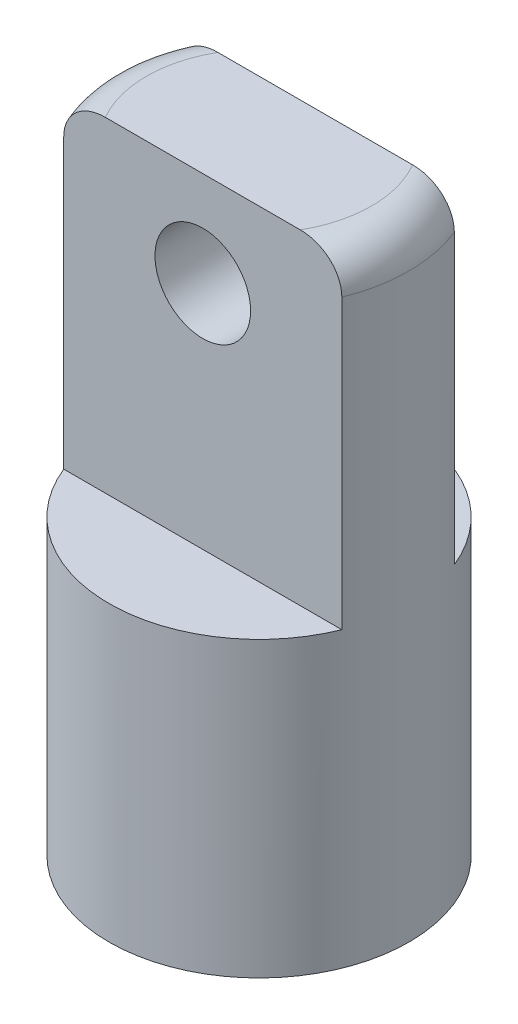
ISO-10303-21;
HEADER;
FILE_DESCRIPTION(('STEP AP214'),'2;1');
FILE_NAME('part.step','',(''),(''),'','','');
FILE_SCHEMA(('AUTOMOTIVE_DESIGN { 1 0 10303 214 1 1 1 1 }'));
ENDSEC;
DATA;
#1=APPLICATION_CONTEXT('core data for automotive mechanical design processes');
#2=APPLICATION_PROTOCOL_DEFINITION('international standard','automotive_design',2000,#1);
#3=PRODUCT_CONTEXT('',#1,'mechanical');
#4=PRODUCT('Part','Part','',(#3));
#5=PRODUCT_RELATED_PRODUCT_CATEGORY('part','',(#4));
#6=PRODUCT_DEFINITION_FORMATION('','',#4);
#7=PRODUCT_DEFINITION_CONTEXT('part definition',#1,'design');
#8=PRODUCT_DEFINITION('design','',#6,#7);
#9=PRODUCT_DEFINITION_SHAPE('','',#8);
#10=(LENGTH_UNIT() NAMED_UNIT(*) SI_UNIT(.MILLI.,.METRE.));
#11=(NAMED_UNIT(*) PLANE_ANGLE_UNIT() SI_UNIT($,.RADIAN.));
#12=(NAMED_UNIT(*) SI_UNIT($,.STERADIAN.) SOLID_ANGLE_UNIT());
#13=UNCERTAINTY_MEASURE_WITH_UNIT(LENGTH_MEASURE(1.E-05),#10,'distance_accuracy_value','');
#14=(GEOMETRIC_REPRESENTATION_CONTEXT(3) GLOBAL_UNCERTAINTY_ASSIGNED_CONTEXT((#13)) GLOBAL_UNIT_ASSIGNED_CONTEXT((#10,
#11,#12)) REPRESENTATION_CONTEXT('',''));
#15=CARTESIAN_POINT('',(0.,0.,0.));
#16=DIRECTION('',(0.,0.,1.));
#17=DIRECTION('',(1.,0.,0.));
#18=AXIS2_PLACEMENT_3D('',#15,#16,#17);
#19=CARTESIAN_POINT('',(0.,16.5,0.));
#20=DIRECTION('',(0.,-1.,0.));
#21=DIRECTION('',(0.,0.,-1.));
#22=AXIS2_PLACEMENT_3D('',#19,#20,#21);
#23=CYLINDRICAL_SURFACE('',#22,4.);
#24=CARTESIAN_POINT('',(0.,5.99,-4.));
#25=CARTESIAN_POINT('',(-0.0694781275048535,5.9899997175562,-3.99999976870814));
#26=CARTESIAN_POINT('',(-0.138959448119634,5.98427983607162,-3.99817280072155));
#27=CARTESIAN_POINT('',(-0.275886697916306,5.96161375224078,-3.99106387603711));
#28=CARTESIAN_POINT('',(-0.343332222967742,5.94466533601831,-3.98578123800401));
#29=CARTESIAN_POINT('',(-0.474193715803413,5.90017381597049,-3.97233734224439));
#30=CARTESIAN_POINT('',(-0.537615856290475,5.87264742256976,-3.9641806264856));
#31=CARTESIAN_POINT('',(-0.658944121988134,5.80785346321896,-3.94582848984878));
#32=CARTESIAN_POINT('',(-0.71684932235342,5.77058426791792,-3.93563272803513));
#33=CARTESIAN_POINT('',(-0.827339957593791,5.68611682974675,-3.91392026388596));
#34=CARTESIAN_POINT('',(-0.879725595012806,5.63866484075298,-3.90237409777714));
#35=CARTESIAN_POINT('',(-0.975944929578622,5.53571888399772,-3.87943076396434));
#36=CARTESIAN_POINT('',(-1.01977696894614,5.48022336093775,-3.86803362554208));
#37=CARTESIAN_POINT('',(-1.09874153414216,5.36101984643483,-3.846360756299));
#38=CARTESIAN_POINT('',(-1.13362209741506,5.29713772577821,-3.83612128520392));
#39=CARTESIAN_POINT('',(-1.19206127035785,5.16403653695254,-3.81836738990007));
#40=CARTESIAN_POINT('',(-1.2156229721165,5.09481893233485,-3.81085222160356));
#41=CARTESIAN_POINT('',(-1.25002016554083,4.9552704525187,-3.79970649861637));
#42=CARTESIAN_POINT('',(-1.2612271872395,4.88504044393,-3.79596284606404));
#43=CARTESIAN_POINT('',(-1.27175780060462,4.74360486605652,-3.792448519286));
#44=CARTESIAN_POINT('',(-1.27108466910094,4.67239957119332,-3.79267674951997));
#45=CARTESIAN_POINT('',(-1.2581641699041,4.53412989157325,-3.7969807386488));
#46=CARTESIAN_POINT('',(-1.24639198042002,4.46701535316813,-3.80089853044576));
#47=CARTESIAN_POINT('',(-1.21237908082845,4.33576814619416,-3.81188314768159));
#48=CARTESIAN_POINT('',(-1.19013722536956,4.27163580471274,-3.81895031764889));
#49=CARTESIAN_POINT('',(-1.13548661443087,4.14705385287107,-3.83555644620986));
#50=CARTESIAN_POINT('',(-1.10293064255435,4.08667374648119,-3.84513082427279));
#51=CARTESIAN_POINT('',(-1.02867816571385,3.97207903093476,-3.86565667683642));
#52=CARTESIAN_POINT('',(-0.98697922249008,3.91786607231005,-3.87660851834808));
#53=CARTESIAN_POINT('',(-0.893304383982998,3.81446190489048,-3.89928615777714));
#54=CARTESIAN_POINT('',(-0.840937086029641,3.76562726950401,-3.91102411889805));
#55=CARTESIAN_POINT('',(-0.728610503858204,3.67734484809147,-3.93349755948319));
#56=CARTESIAN_POINT('',(-0.668650620914784,3.63789780304586,-3.94423295977278));
#57=CARTESIAN_POINT('',(-0.542137579133865,3.56925821441149,-3.96361074874143));
#58=CARTESIAN_POINT('',(-0.475533996002266,3.54015317098005,-3.972235094503));
#59=CARTESIAN_POINT('',(-0.338038188376032,3.49366722157475,-3.98628865725283));
#60=CARTESIAN_POINT('',(-0.267147317502995,3.47628263595236,-3.99171887697157));
#61=CARTESIAN_POINT('',(-0.12611406157382,3.45434417821691,-3.99860987572172));
#62=CARTESIAN_POINT('',(-0.0560539133869254,3.44930780744824,-4.00021984340975));
#63=CARTESIAN_POINT('',(0.0839193333622004,3.45084504777036,-3.99973162638443));
#64=CARTESIAN_POINT('',(0.153832452574231,3.45741690192619,-3.99763400282459));
#65=CARTESIAN_POINT('',(0.289649571216873,3.4815979281653,-3.99006444968686));
#66=CARTESIAN_POINT('',(0.355610472033454,3.49891787603743,-3.98468100007415));
#67=CARTESIAN_POINT('',(0.483669854221075,3.54374849378021,-3.97117272755714));
#68=CARTESIAN_POINT('',(0.545767853062375,3.5712604337978,-3.96304756298597));
#69=CARTESIAN_POINT('',(0.666056605274354,3.63645725065976,-3.94463755171274));
#70=CARTESIAN_POINT('',(0.724111846583209,3.67437802399565,-3.93430403678396));
#71=CARTESIAN_POINT('',(0.833195647610185,3.75903448227932,-3.91265673613529));
#72=CARTESIAN_POINT('',(0.884222236774226,3.80577263060028,-3.90134267695242));
#73=CARTESIAN_POINT('',(0.979972556103621,3.90900690278926,-3.87842479752882));
#74=CARTESIAN_POINT('',(1.02435223440474,3.96582445711621,-3.86682810743868));
#75=CARTESIAN_POINT('',(1.10298077839377,4.08635197604293,-3.84514014023485));
#76=CARTESIAN_POINT('',(1.13722975464655,4.15006186541049,-3.8350488466921));
#77=CARTESIAN_POINT('',(1.1944226299821,4.28246742208174,-3.81762370141084));
#78=CARTESIAN_POINT('',(1.21740601455216,4.35114469308412,-3.8102802403533));
#79=CARTESIAN_POINT('',(1.25139491731108,4.49167697310513,-3.799254696408));
#80=CARTESIAN_POINT('',(1.26240518484185,4.56353071034535,-3.79557116179783));
#81=CARTESIAN_POINT('',(1.27178712505359,4.70477013780484,-3.79243711089675));
#82=CARTESIAN_POINT('',(1.27072472730476,4.77411448323694,-3.7927970400332));
#83=CARTESIAN_POINT('',(1.25736392956772,4.91158399673968,-3.79724695012912));
#84=CARTESIAN_POINT('',(1.24506608589155,4.97970922500342,-3.80133674640788));
#85=CARTESIAN_POINT('',(1.20996762092647,5.11175879017132,-3.81265102262785));
#86=CARTESIAN_POINT('',(1.18733392608222,5.17573209923701,-3.81982557914821));
#87=CARTESIAN_POINT('',(1.13233847807553,5.29902388086637,-3.83648684518176));
#88=CARTESIAN_POINT('',(1.0999747010496,5.35834138177877,-3.84597403564658));
#89=CARTESIAN_POINT('',(1.02491680607092,5.47322011153838,-3.86666741148792));
#90=CARTESIAN_POINT('',(0.981859673916555,5.52853443946034,-3.87792737319204));
#91=CARTESIAN_POINT('',(0.887270136427147,5.63133583270108,-3.9006556436682));
#92=CARTESIAN_POINT('',(0.835735434804358,5.67882077030501,-3.91212400813878));
#93=CARTESIAN_POINT('',(0.723540314965778,5.76623900559454,-3.93444609967246));
#94=CARTESIAN_POINT('',(0.662628648029114,5.80585960168265,-3.94526553534406));
#95=CARTESIAN_POINT('',(0.534666840989381,5.87424832317417,-3.96463228451439));
#96=CARTESIAN_POINT('',(0.467618931966828,5.90302037368005,-3.97318041945919));
#97=CARTESIAN_POINT('',(0.334494035012195,5.94700963026909,-3.98650813645557));
#98=CARTESIAN_POINT('',(0.268723140553827,5.96308340103413,-3.99152275950714));
#99=CARTESIAN_POINT('',(0.135302230992776,5.9845775609217,-3.99826844558851));
#100=CARTESIAN_POINT('',(0.0676526292563807,5.99000027502276,-4.00000022521479));
#101=CARTESIAN_POINT('',(0.,5.99,-4.));
#102=B_SPLINE_CURVE_WITH_KNOTS('',3,(#24,#25,#26,#27,#28,#29,#30,#31,#32,#33,#34,#35,#36,#37,
#38,#39,#40,#41,#42,#43,#44,#45,#46,#47,#48,#49,#50,#51,#52,#53,#54,#55,#56,#57,#58,#59,#60,#61,
#62,#63,#64,#65,#66,#67,#68,#69,#70,#71,#72,#73,#74,#75,#76,#77,#78,#79,#80,#81,#82,#83,#84,#85,
#86,#87,#88,#89,#90,#91,#92,#93,#94,#95,#96,#97,#98,#99,#100,#101),.UNSPECIFIED.,.T.,.F.,(4,2,2,
2,2,2,2,2,2,2,2,2,2,2,2,2,2,2,2,2,2,2,2,2,2,2,2,2,2,2,2,2,2,2,2,2,2,2,4),(0.,0.208185645532878,
0.4164123502491,0.624311454811364,0.832245349935386,1.04613309111789,1.2600622449639,
1.47947832887018,1.69883443851488,1.91139712257572,2.12390117769036,2.32770164838411,
2.53152441944741,2.73839846723321,2.94532775171272,3.16199895982061,3.37868726453312,
3.59716753250318,3.81557917641053,4.02530997762792,4.23500903826465,4.4392962609747,
4.64360895094581,4.85300085903446,5.06245135330427,5.28048650053731,5.49851926808158,
5.71578227475694,5.93295906886833,6.13999895587823,6.34702859206745,6.55082684849656,
6.7546675244587,6.96670353603399,7.17879707587158,7.39812250842272,7.61736851071706,
7.82012846154426,8.02284414775431),.UNSPECIFIED.);
#103=CARTESIAN_POINT('',(0.,5.99,-4.));
#104=VERTEX_POINT('',#103);
#105=EDGE_CURVE('E137',#104,#104,#102,.T.);
#106=ORIENTED_EDGE('',*,*,#105,.T.);
#107=EDGE_LOOP('',(#106));
#108=FACE_BOUND('',#107,.T.);
#109=DIRECTION('',(0.,1.,0.));
#110=VECTOR('',#109,1.);
#111=CARTESIAN_POINT('',(-3.70809924354783,7.82,1.5));
#112=LINE('',#111,#110);
#113=CARTESIAN_POINT('',(-3.70809924354783,7.82,1.5));
#114=VERTEX_POINT('',#113);
#115=CARTESIAN_POINT('',(-3.70809924354783,15.5,1.5));
#116=VERTEX_POINT('',#115);
#117=EDGE_CURVE('E122',#114,#116,#112,.T.);
#118=ORIENTED_EDGE('',*,*,#117,.T.);
#119=CARTESIAN_POINT('',(0.,15.5,0.));
#120=DIRECTION('',(0.,1.,0.));
#121=DIRECTION('',(0.,0.,1.));
#122=AXIS2_PLACEMENT_3D('',#119,#120,#121);
#123=CIRCLE('',#122,4.);
#124=CARTESIAN_POINT('',(-3.70809924354783,15.5,-1.5));
#125=VERTEX_POINT('',#124);
#126=EDGE_CURVE('E64',#116,#125,#123,.F.);
#127=ORIENTED_EDGE('',*,*,#126,.T.);
#128=DIRECTION('',(0.,1.,0.));
#129=VECTOR('',#128,1.);
#130=CARTESIAN_POINT('',(-3.70809924354783,7.82,-1.5));
#131=LINE('',#130,#129);
#132=CARTESIAN_POINT('',(-3.70809924354783,7.82,-1.5));
#133=VERTEX_POINT('',#132);
#134=EDGE_CURVE('E102',#133,#125,#131,.T.);
#135=ORIENTED_EDGE('',*,*,#134,.F.);
#136=CARTESIAN_POINT('',(0.,7.82,0.));
#137=DIRECTION('',(0.,1.,0.));
#138=DIRECTION('',(0.,0.,1.));
#139=AXIS2_PLACEMENT_3D('',#136,#137,#138);
#140=CIRCLE('',#139,4.);
#141=CARTESIAN_POINT('',(3.70809924354783,7.82,-1.5));
#142=VERTEX_POINT('',#141);
#143=EDGE_CURVE('E95',#142,#133,#140,.T.);
#144=ORIENTED_EDGE('',*,*,#143,.F.);
#145=DIRECTION('',(0.,1.,0.));
#146=VECTOR('',#145,1.);
#147=CARTESIAN_POINT('',(3.70809924354783,7.82,-1.5));
#148=LINE('',#147,#146);
#149=CARTESIAN_POINT('',(3.70809924354783,15.5,-1.5));
#150=VERTEX_POINT('',#149);
#151=EDGE_CURVE('E104',#142,#150,#148,.T.);
#152=ORIENTED_EDGE('',*,*,#151,.T.);
#153=CARTESIAN_POINT('',(0.,15.5,0.));
#154=DIRECTION('',(0.,1.,0.));
#155=DIRECTION('',(0.,0.,1.));
#156=AXIS2_PLACEMENT_3D('',#153,#154,#155);
#157=CIRCLE('',#156,4.);
#158=CARTESIAN_POINT('',(3.70809924354783,15.5,1.5));
#159=VERTEX_POINT('',#158);
#160=EDGE_CURVE('E183',#150,#159,#157,.F.);
#161=ORIENTED_EDGE('',*,*,#160,.T.);
#162=DIRECTION('',(0.,1.,0.));
#163=VECTOR('',#162,1.);
#164=CARTESIAN_POINT('',(3.70809924354783,7.82,1.5));
#165=LINE('',#164,#163);
#166=CARTESIAN_POINT('',(3.70809924354783,7.82,1.5));
#167=VERTEX_POINT('',#166);
#168=EDGE_CURVE('E118',#167,#159,#165,.T.);
#169=ORIENTED_EDGE('',*,*,#168,.F.);
#170=CARTESIAN_POINT('',(0.,7.82,0.));
#171=DIRECTION('',(0.,1.,0.));
#172=DIRECTION('',(0.,0.,1.));
#173=AXIS2_PLACEMENT_3D('',#170,#171,#172);
#174=CIRCLE('',#173,4.);
#175=EDGE_CURVE('E112',#114,#167,#174,.T.);
#176=ORIENTED_EDGE('',*,*,#175,.F.);
#177=EDGE_LOOP('',(#118,#127,#135,#144,#152,#161,#169,#176));
#178=FACE_BOUND('',#177,.T.);
#179=CARTESIAN_POINT('',(0.,0.,0.));
#180=DIRECTION('',(0.,1.,0.));
#181=DIRECTION('',(0.,0.,1.));
#182=AXIS2_PLACEMENT_3D('',#179,#180,#181);
#183=CIRCLE('',#182,4.);
#184=CARTESIAN_POINT('',(0.,0.,4.));
#185=VERTEX_POINT('',#184);
#186=EDGE_CURVE('E108',#185,#185,#183,.T.);
#187=ORIENTED_EDGE('',*,*,#186,.T.);
#188=EDGE_LOOP('',(#187));
#189=FACE_BOUND('',#188,.T.);
#190=ADVANCED_FACE('F36',(#108,#178,#189),#23,.T.);
#191=CARTESIAN_POINT('',(0.,16.5,0.));
#192=DIRECTION('',(0.,1.,0.));
#193=DIRECTION('',(0.,0.,1.));
#194=AXIS2_PLACEMENT_3D('',#191,#192,#193);
#195=PLANE('',#194);
#196=DIRECTION('',(1.,0.,0.));
#197=VECTOR('',#196,1.);
#198=CARTESIAN_POINT('',(-3.70809924354783,16.5,-1.5));
#199=LINE('',#198,#197);
#200=CARTESIAN_POINT('',(-2.59807621135332,16.5,-1.5));
#201=VERTEX_POINT('',#200);
#202=CARTESIAN_POINT('',(2.59807621135332,16.5,-1.5));
#203=VERTEX_POINT('',#202);
#204=EDGE_CURVE('E99',#201,#203,#199,.T.);
#205=ORIENTED_EDGE('',*,*,#204,.F.);
#206=CARTESIAN_POINT('',(0.,16.5,0.));
#207=DIRECTION('',(0.,1.,0.));
#208=DIRECTION('',(0.,0.,1.));
#209=AXIS2_PLACEMENT_3D('',#206,#207,#208);
#210=CIRCLE('',#209,3.);
#211=CARTESIAN_POINT('',(-2.59807621135332,16.5,1.5));
#212=VERTEX_POINT('',#211);
#213=EDGE_CURVE('E209',#201,#212,#210,.T.);
#214=ORIENTED_EDGE('',*,*,#213,.T.);
#215=DIRECTION('',(-1.,0.,0.));
#216=VECTOR('',#215,1.);
#217=CARTESIAN_POINT('',(-3.70809924354783,16.5,1.5));
#218=LINE('',#217,#216);
#219=CARTESIAN_POINT('',(2.59807621135332,16.5,1.5));
#220=VERTEX_POINT('',#219);
#221=EDGE_CURVE('E115',#220,#212,#218,.T.);
#222=ORIENTED_EDGE('',*,*,#221,.F.);
#223=CARTESIAN_POINT('',(0.,16.5,0.));
#224=DIRECTION('',(0.,1.,0.));
#225=DIRECTION('',(0.,0.,1.));
#226=AXIS2_PLACEMENT_3D('',#223,#224,#225);
#227=CIRCLE('',#226,3.);
#228=EDGE_CURVE('E128',#220,#203,#227,.T.);
#229=ORIENTED_EDGE('',*,*,#228,.T.);
#230=EDGE_LOOP('',(#205,#214,#222,#229));
#231=FACE_BOUND('',#230,.T.);
#232=ADVANCED_FACE('F165',(#231),#195,.T.);
#233=CARTESIAN_POINT('',(0.,0.,0.));
#234=DIRECTION('',(0.,1.,0.));
#235=DIRECTION('',(0.,0.,1.));
#236=AXIS2_PLACEMENT_3D('',#233,#234,#235);
#237=PLANE('',#236);
#238=CARTESIAN_POINT('',(0.,0.,0.));
#239=DIRECTION('',(0.,-1.,0.));
#240=DIRECTION('',(0.,0.,-1.));
#241=AXIS2_PLACEMENT_3D('',#238,#239,#240);
#242=CIRCLE('',#241,2.);
#243=CARTESIAN_POINT('',(0.,0.,-2.));
#244=VERTEX_POINT('',#243);
#245=EDGE_CURVE('E241',#244,#244,#242,.T.);
#246=ORIENTED_EDGE('',*,*,#245,.F.);
#247=EDGE_LOOP('',(#246));
#248=FACE_BOUND('',#247,.T.);
#249=ORIENTED_EDGE('',*,*,#186,.F.);
#250=EDGE_LOOP('',(#249));
#251=FACE_BOUND('',#250,.T.);
#252=ADVANCED_FACE('F167',(#248,#251),#237,.F.);
#253=CARTESIAN_POINT('',(-3.70809924354783,7.82,1.5));
#254=DIRECTION('',(0.,0.,-1.));
#255=DIRECTION('',(-1.,0.,0.));
#256=AXIS2_PLACEMENT_3D('',#253,#254,#255);
#257=PLANE('',#256);
#258=CARTESIAN_POINT('',(0.,13.965,1.5));
#259=DIRECTION('',(0.,0.,1.));
#260=DIRECTION('',(1.,0.,0.));
#261=AXIS2_PLACEMENT_3D('',#258,#259,#260);
#262=CIRCLE('',#261,1.275);
#263=CARTESIAN_POINT('',(1.275,13.965,1.5));
#264=VERTEX_POINT('',#263);
#265=EDGE_CURVE('E138',#264,#264,#262,.T.);
#266=ORIENTED_EDGE('',*,*,#265,.F.);
#267=EDGE_LOOP('',(#266));
#268=FACE_BOUND('',#267,.T.);
#269=ORIENTED_EDGE('',*,*,#221,.T.);
#270=CARTESIAN_POINT('',(-2.59807621135332,16.5,1.5));
#271=CARTESIAN_POINT('',(-2.63260692816756,16.499998405373,1.5));
#272=CARTESIAN_POINT('',(-2.66712683035464,16.49865747774,1.5));
#273=CARTESIAN_POINT('',(-2.73596780965519,16.4932185089883,1.5));
#274=CARTESIAN_POINT('',(-2.77028875875725,16.48911885674,1.5));
#275=CARTESIAN_POINT('',(-2.87289967995284,16.4725220774503,1.5));
#276=CARTESIAN_POINT('',(-2.94055768266121,16.4557258031349,1.5));
#277=CARTESIAN_POINT('',(-3.07210546526726,16.4103591217038,1.5));
#278=CARTESIAN_POINT('',(-3.13598002632609,16.3817444259556,1.5));
#279=CARTESIAN_POINT('',(-3.25709544247385,16.3130183114015,1.5));
#280=CARTESIAN_POINT('',(-3.31435184888779,16.2729346465143,1.5));
#281=CARTESIAN_POINT('',(-3.41423464308313,16.1869072090615,1.5));
#282=CARTESIAN_POINT('',(-3.45776431581029,16.1420119541572,1.5));
#283=CARTESIAN_POINT('',(-3.53571143300236,16.0448404507181,1.5));
#284=CARTESIAN_POINT('',(-3.57012792018051,15.9925634276553,1.5));
#285=CARTESIAN_POINT('',(-3.62541748185334,15.8876746437288,1.5));
#286=CARTESIAN_POINT('',(-3.64727515844404,15.8355792263424,1.5));
#287=CARTESIAN_POINT('',(-3.681305478355,15.7283683063485,1.5));
#288=CARTESIAN_POINT('',(-3.69349732501103,15.673259025622,1.5));
#289=CARTESIAN_POINT('',(-3.70310977240298,15.5980700680535,1.5));
#290=CARTESIAN_POINT('',(-3.70498115412505,15.5784868592584,1.5));
#291=CARTESIAN_POINT('',(-3.7074742440008,15.539272295765,1.5));
#292=CARTESIAN_POINT('',(-3.70809793475093,15.5196410671577,1.5));
#293=CARTESIAN_POINT('',(-3.7080992435479,15.5,1.5));
#294=B_SPLINE_CURVE_WITH_KNOTS('',3,(#270,#271,#272,#273,#274,#275,#276,#277,#278,#279,#280,
#281,#282,#283,#284,#285,#286,#287,#288,#289,#290,#291,#292,#293),.UNSPECIFIED.,.F.,.F.,(4,2,2,
2,2,2,2,2,2,2,2,4),(0.,0.103540729644594,0.20714198091128,0.415174657448795,0.623994097641523,
0.832312425695074,1.01888471946034,1.20547660378438,1.37411211759147,1.54241175369337,
1.60139924811146,1.66029293597914),.UNSPECIFIED.);
#295=EDGE_CURVE('E175',#212,#116,#294,.T.);
#296=ORIENTED_EDGE('',*,*,#295,.T.);
#297=ORIENTED_EDGE('',*,*,#117,.F.);
#298=DIRECTION('',(-1.,0.,0.));
#299=VECTOR('',#298,1.);
#300=CARTESIAN_POINT('',(-3.70809924354783,7.82,1.5));
#301=LINE('',#300,#299);
#302=EDGE_CURVE('E114',#167,#114,#301,.T.);
#303=ORIENTED_EDGE('',*,*,#302,.F.);
#304=ORIENTED_EDGE('',*,*,#168,.T.);
#305=CARTESIAN_POINT('',(3.70809924354783,15.5,1.5));
#306=CARTESIAN_POINT('',(3.7080998442608,15.5265363741995,1.5));
#307=CARTESIAN_POINT('',(3.70695903850462,15.5530596050032,1.5));
#308=CARTESIAN_POINT('',(3.70241328757826,15.6059070718273,1.5));
#309=CARTESIAN_POINT('',(3.69900870771732,15.6322313392617,1.5));
#310=CARTESIAN_POINT('',(3.68545665818549,15.7104869011101,1.5));
#311=CARTESIAN_POINT('',(3.67197058936486,15.7618784362202,1.5));
#312=CARTESIAN_POINT('',(3.63659307198447,15.8616379359718,1.5));
#313=CARTESIAN_POINT('',(3.61470221690554,15.910006113819,1.5));
#314=CARTESIAN_POINT('',(3.56329322018881,16.0025145155707,1.5));
#315=CARTESIAN_POINT('',(3.53377274088799,16.0466534379696,1.5));
#316=CARTESIAN_POINT('',(3.46729211712947,16.130680412065,1.5));
#317=CARTESIAN_POINT('',(3.4301676827936,16.1704381035477,1.5));
#318=CARTESIAN_POINT('',(3.35015684421222,16.2436245218095,1.5));
#319=CARTESIAN_POINT('',(3.30727023578654,16.2770530242153,1.5));
#320=CARTESIAN_POINT('',(3.21391413756315,16.3391069991942,1.5));
#321=CARTESIAN_POINT('',(3.16312803728051,16.3672550830636,1.5));
#322=CARTESIAN_POINT('',(3.05781936389701,16.4154954436759,1.5));
#323=CARTESIAN_POINT('',(3.00329247116784,16.4355782173548,1.5));
#324=CARTESIAN_POINT('',(2.89082833467788,16.4679467839482,1.5));
#325=CARTESIAN_POINT('',(2.83284492216188,16.4800701823049,1.5));
#326=CARTESIAN_POINT('',(2.71590940039349,16.4960985416027,1.5));
#327=CARTESIAN_POINT('',(2.6569604622494,16.5000264453792,1.5));
#328=CARTESIAN_POINT('',(2.59807621135332,16.5,1.5));
#329=B_SPLINE_CURVE_WITH_KNOTS('',3,(#305,#306,#307,#308,#309,#310,#311,#312,#313,#314,#315,
#316,#317,#318,#319,#320,#321,#322,#323,#324,#325,#326,#327,#328),.UNSPECIFIED.,.F.,.F.,(4,2,2,
2,2,2,2,2,2,2,2,4),(0.,0.0795587225010725,0.159104609585048,0.317670922334591,0.476226040419469,
0.634829796384314,0.797312405637619,0.959800773911729,1.13327237377034,1.30694777347188,
1.4840647977959,1.66068532384634),.UNSPECIFIED.);
#330=EDGE_CURVE('E184',#159,#220,#329,.T.);
#331=ORIENTED_EDGE('',*,*,#330,.T.);
#332=EDGE_LOOP('',(#269,#296,#297,#303,#304,#331));
#333=FACE_BOUND('',#332,.T.);
#334=ADVANCED_FACE('F191',(#268,#333),#257,.F.);
#335=CARTESIAN_POINT('',(0.,7.82,0.));
#336=DIRECTION('',(0.,1.,0.));
#337=DIRECTION('',(0.,0.,1.));
#338=AXIS2_PLACEMENT_3D('',#335,#336,#337);
#339=PLANE('',#338);
#340=ORIENTED_EDGE('',*,*,#175,.T.);
#341=ORIENTED_EDGE('',*,*,#302,.T.);
#342=EDGE_LOOP('',(#340,#341));
#343=FACE_BOUND('',#342,.T.);
#344=ADVANCED_FACE('F195',(#343),#339,.T.);
#345=CARTESIAN_POINT('',(-3.70809924354783,7.82,-1.5));
#346=DIRECTION('',(0.,0.,1.));
#347=DIRECTION('',(1.,0.,0.));
#348=AXIS2_PLACEMENT_3D('',#345,#346,#347);
#349=PLANE('',#348);
#350=CARTESIAN_POINT('',(0.,13.965,-1.5));
#351=DIRECTION('',(0.,0.,1.));
#352=DIRECTION('',(1.,0.,0.));
#353=AXIS2_PLACEMENT_3D('',#350,#351,#352);
#354=CIRCLE('',#353,1.275);
#355=CARTESIAN_POINT('',(1.275,13.965,-1.5));
#356=VERTEX_POINT('',#355);
#357=EDGE_CURVE('E139',#356,#356,#354,.T.);
#358=ORIENTED_EDGE('',*,*,#357,.T.);
#359=EDGE_LOOP('',(#358));
#360=FACE_BOUND('',#359,.T.);
#361=ORIENTED_EDGE('',*,*,#134,.T.);
#362=CARTESIAN_POINT('',(-3.70809924354783,15.5,-1.5));
#363=CARTESIAN_POINT('',(-3.7080998442608,15.5265363741995,-1.5));
#364=CARTESIAN_POINT('',(-3.70695903850462,15.5530596050032,-1.5));
#365=CARTESIAN_POINT('',(-3.70241328757826,15.6059070718273,-1.5));
#366=CARTESIAN_POINT('',(-3.69900870771732,15.6322313392617,-1.5));
#367=CARTESIAN_POINT('',(-3.68545665818549,15.7104869011101,-1.5));
#368=CARTESIAN_POINT('',(-3.67197058936486,15.7618784362202,-1.5));
#369=CARTESIAN_POINT('',(-3.63659307198447,15.8616379359718,-1.5));
#370=CARTESIAN_POINT('',(-3.61470221690554,15.910006113819,-1.5));
#371=CARTESIAN_POINT('',(-3.56329322018881,16.0025145155707,-1.5));
#372=CARTESIAN_POINT('',(-3.53377274088799,16.0466534379696,-1.5));
#373=CARTESIAN_POINT('',(-3.46729211712947,16.130680412065,-1.5));
#374=CARTESIAN_POINT('',(-3.4301676827936,16.1704381035477,-1.5));
#375=CARTESIAN_POINT('',(-3.35015684421222,16.2436245218095,-1.5));
#376=CARTESIAN_POINT('',(-3.30727023578654,16.2770530242153,-1.5));
#377=CARTESIAN_POINT('',(-3.21391413756315,16.3391069991942,-1.5));
#378=CARTESIAN_POINT('',(-3.16312803728051,16.3672550830636,-1.5));
#379=CARTESIAN_POINT('',(-3.05781936389701,16.4154954436759,-1.5));
#380=CARTESIAN_POINT('',(-3.00329247116784,16.4355782173548,-1.5));
#381=CARTESIAN_POINT('',(-2.89082833467788,16.4679467839482,-1.5));
#382=CARTESIAN_POINT('',(-2.83284492216188,16.4800701823049,-1.5));
#383=CARTESIAN_POINT('',(-2.71590940039349,16.4960985416027,-1.5));
#384=CARTESIAN_POINT('',(-2.6569604622494,16.5000264453792,-1.5));
#385=CARTESIAN_POINT('',(-2.59807621135332,16.5,-1.5));
#386=B_SPLINE_CURVE_WITH_KNOTS('',3,(#362,#363,#364,#365,#366,#367,#368,#369,#370,#371,#372,
#373,#374,#375,#376,#377,#378,#379,#380,#381,#382,#383,#384,#385),.UNSPECIFIED.,.F.,.F.,(4,2,2,
2,2,2,2,2,2,2,2,4),(0.,0.0795587225010725,0.159104609585048,0.317670922334591,0.476226040419469,
0.634829796384314,0.797312405637619,0.959800773911729,1.13327237377034,1.30694777347188,
1.4840647977959,1.66068532384634),.UNSPECIFIED.);
#387=EDGE_CURVE('E11',#125,#201,#386,.T.);
#388=ORIENTED_EDGE('',*,*,#387,.T.);
#389=ORIENTED_EDGE('',*,*,#204,.T.);
#390=CARTESIAN_POINT('',(2.59807621135332,16.5,-1.5));
#391=CARTESIAN_POINT('',(2.63260692816756,16.499998405373,-1.5));
#392=CARTESIAN_POINT('',(2.66712683035464,16.49865747774,-1.5));
#393=CARTESIAN_POINT('',(2.73596780965519,16.4932185089883,-1.5));
#394=CARTESIAN_POINT('',(2.77028875875725,16.48911885674,-1.5));
#395=CARTESIAN_POINT('',(2.87289967995284,16.4725220774503,-1.5));
#396=CARTESIAN_POINT('',(2.94055768266121,16.4557258031349,-1.5));
#397=CARTESIAN_POINT('',(3.07210546526726,16.4103591217038,-1.5));
#398=CARTESIAN_POINT('',(3.13598002632609,16.3817444259556,-1.5));
#399=CARTESIAN_POINT('',(3.25709544247385,16.3130183114015,-1.5));
#400=CARTESIAN_POINT('',(3.31435184888779,16.2729346465143,-1.5));
#401=CARTESIAN_POINT('',(3.41423464308313,16.1869072090615,-1.5));
#402=CARTESIAN_POINT('',(3.45776431581029,16.1420119541572,-1.5));
#403=CARTESIAN_POINT('',(3.53571143300236,16.0448404507181,-1.5));
#404=CARTESIAN_POINT('',(3.57012792018051,15.9925634276553,-1.5));
#405=CARTESIAN_POINT('',(3.62541748185334,15.8876746437288,-1.5));
#406=CARTESIAN_POINT('',(3.64727515844404,15.8355792263424,-1.5));
#407=CARTESIAN_POINT('',(3.681305478355,15.7283683063485,-1.5));
#408=CARTESIAN_POINT('',(3.69349732501103,15.673259025622,-1.5));
#409=CARTESIAN_POINT('',(3.70310977240298,15.5980700680535,-1.5));
#410=CARTESIAN_POINT('',(3.70498115412505,15.5784868592584,-1.5));
#411=CARTESIAN_POINT('',(3.7074742440008,15.539272295765,-1.5));
#412=CARTESIAN_POINT('',(3.70809793475093,15.5196410671577,-1.5));
#413=CARTESIAN_POINT('',(3.7080992435479,15.5,-1.5));
#414=B_SPLINE_CURVE_WITH_KNOTS('',3,(#390,#391,#392,#393,#394,#395,#396,#397,#398,#399,#400,
#401,#402,#403,#404,#405,#406,#407,#408,#409,#410,#411,#412,#413),.UNSPECIFIED.,.F.,.F.,(4,2,2,
2,2,2,2,2,2,2,2,4),(0.,0.103540729644594,0.20714198091128,0.415174657448795,0.623994097641523,
0.832312425695074,1.01888471946034,1.20547660378438,1.37411211759147,1.54241175369337,
1.60139924811146,1.66029293597914),.UNSPECIFIED.);
#415=EDGE_CURVE('E50',#203,#150,#414,.T.);
#416=ORIENTED_EDGE('',*,*,#415,.T.);
#417=ORIENTED_EDGE('',*,*,#151,.F.);
#418=DIRECTION('',(1.,0.,0.));
#419=VECTOR('',#418,1.);
#420=CARTESIAN_POINT('',(-3.70809924354783,7.82,-1.5));
#421=LINE('',#420,#419);
#422=EDGE_CURVE('E98',#133,#142,#421,.T.);
#423=ORIENTED_EDGE('',*,*,#422,.F.);
#424=EDGE_LOOP('',(#361,#388,#389,#416,#417,#423));
#425=FACE_BOUND('',#424,.T.);
#426=ADVANCED_FACE('F101',(#360,#425),#349,.F.);
#427=CARTESIAN_POINT('',(0.,7.82,0.));
#428=DIRECTION('',(0.,1.,0.));
#429=DIRECTION('',(0.,0.,1.));
#430=AXIS2_PLACEMENT_3D('',#427,#428,#429);
#431=PLANE('',#430);
#432=ORIENTED_EDGE('',*,*,#143,.T.);
#433=ORIENTED_EDGE('',*,*,#422,.T.);
#434=EDGE_LOOP('',(#432,#433));
#435=FACE_BOUND('',#434,.T.);
#436=ADVANCED_FACE('F97',(#435),#431,.T.);
#437=CARTESIAN_POINT('',(0.,7.,0.));
#438=DIRECTION('',(0.,-1.,0.));
#439=DIRECTION('',(0.,0.,-1.));
#440=AXIS2_PLACEMENT_3D('',#437,#438,#439);
#441=CYLINDRICAL_SURFACE('',#440,2.);
#442=CARTESIAN_POINT('',(0.,5.99,-2.));
#443=CARTESIAN_POINT('',(0.0643437840148364,5.9899955208965,-1.99999581133543));
#444=CARTESIAN_POINT('',(0.128757056632687,5.9850772815804,-1.99686294178399));
#445=CARTESIAN_POINT('',(0.255596306141159,5.96567410826439,-1.98462830542178));
#446=CARTESIAN_POINT('',(0.318018579203752,5.95117232338945,-1.97551602513334));
#447=CARTESIAN_POINT('',(0.438795091004652,5.91345819613302,-1.95223564032276));
#448=CARTESIAN_POINT('',(0.497167873990404,5.89028916466477,-1.93809269143779));
#449=CARTESIAN_POINT('',(0.608985269246453,5.83619836492275,-1.90591891403795));
#450=CARTESIAN_POINT('',(0.662430271836264,5.80527721140167,-1.88788839382807));
#451=CARTESIAN_POINT('',(0.76777986462012,5.73379969609768,-1.84768628267212));
#452=CARTESIAN_POINT('',(0.81920751633358,5.6926650713227,-1.82529738283389));
#453=CARTESIAN_POINT('',(0.914894897920078,5.60326834151135,-1.77926761671343));
#454=CARTESIAN_POINT('',(0.959144619961295,5.55499646146388,-1.75562506239821));
#455=CARTESIAN_POINT('',(1.04556372103353,5.44475685118391,-1.70575991125995));
#456=CARTESIAN_POINT('',(1.08656443484603,5.38181772883899,-1.67964233413608));
#457=CARTESIAN_POINT('',(1.15730035981826,5.24842210162808,-1.63171248861576));
#458=CARTESIAN_POINT('',(1.18705481483151,5.17797870485416,-1.60989289671783));
#459=CARTESIAN_POINT('',(1.22751697847234,5.05060555011768,-1.57913536475767));
#460=CARTESIAN_POINT('',(1.24118708822782,4.99507498282813,-1.56831427008131));
#461=CARTESIAN_POINT('',(1.26094177967397,4.88190460177589,-1.55247907657832));
#462=CARTESIAN_POINT('',(1.26703761128763,4.82426804739175,-1.54745636631663));
#463=CARTESIAN_POINT('',(1.27127406446309,4.70832709416254,-1.54397919800359));
#464=CARTESIAN_POINT('',(1.26939139143517,4.65002123608861,-1.54554397313872));
#465=CARTESIAN_POINT('',(1.25774909222549,4.53471226776133,-1.55503032346839));
#466=CARTESIAN_POINT('',(1.24798302403762,4.47771026215502,-1.56295709741233));
#467=CARTESIAN_POINT('',(1.22152278401564,4.36803119187361,-1.58371441433381));
#468=CARTESIAN_POINT('',(1.20502564909054,4.31527843879496,-1.59640473241629));
#469=CARTESIAN_POINT('',(1.16578008003308,4.21319526014546,-1.62528429665123));
#470=CARTESIAN_POINT('',(1.14302955584048,4.16386598571471,-1.64147471224871));
#471=CARTESIAN_POINT('',(1.08692912568132,4.05999637954161,-1.67926587165064));
#472=CARTESIAN_POINT('',(1.05238431497931,4.00626307339906,-1.7013091884732));
#473=CARTESIAN_POINT('',(0.975866185202056,3.90475036053629,-1.74632767284721));
#474=CARTESIAN_POINT('',(0.933884163483864,3.85697804190673,-1.76930390750538));
#475=CARTESIAN_POINT('',(0.834961953881197,3.76013714435751,-1.81835030192797));
#476=CARTESIAN_POINT('',(0.776689478567885,3.71232862076684,-1.84425057501507));
#477=CARTESIAN_POINT('',(0.651491641004741,3.62721935050481,-1.89209773834646));
#478=CARTESIAN_POINT('',(0.584575789365704,3.58990719562813,-1.91404891132471));
#479=CARTESIAN_POINT('',(0.457575381007711,3.53368328669585,-1.94783235147793));
#480=CARTESIAN_POINT('',(0.39875988308804,3.51259135524575,-1.9608074637274));
#481=CARTESIAN_POINT('',(0.277817135895095,3.47917590467573,-1.98155775943692));
#482=CARTESIAN_POINT('',(0.215692559560239,3.46684542050038,-1.98933707308581));
#483=CARTESIAN_POINT('',(0.0896313919788329,3.45157227526775,-1.99899306790945));
#484=CARTESIAN_POINT('',(0.025689674366186,3.44865954133071,-2.00085093201722));
#485=CARTESIAN_POINT('',(-0.101790539125332,3.45248074250384,-1.99842508476271));
#486=CARTESIAN_POINT('',(-0.165329002914738,3.45921543588835,-1.99414089064318));
#487=CARTESIAN_POINT('',(-0.286898089347144,3.48136457810311,-1.98021438908333));
#488=CARTESIAN_POINT('',(-0.345045137213484,3.49632688214021,-1.9708515146151));
#489=CARTESIAN_POINT('',(-0.457863068268169,3.53391412272923,-1.94773731490537));
#490=CARTESIAN_POINT('',(-0.512533362945069,3.55654035247812,-1.93398524906227));
#491=CARTESIAN_POINT('',(-0.621449843540164,3.61064149668281,-1.90191094950237));
#492=CARTESIAN_POINT('',(-0.675345040927711,3.64266006161748,-1.88331997205671));
#493=CARTESIAN_POINT('',(-0.777269288797028,3.71371050449642,-1.84359720139863));
#494=CARTESIAN_POINT('',(-0.825293567758176,3.7527480241866,-1.82246336882577));
#495=CARTESIAN_POINT('',(-0.921730880027256,3.84345353528468,-1.77586419557004));
#496=CARTESIAN_POINT('',(-0.969106251342363,3.89613871423087,-1.75022686776105));
#497=CARTESIAN_POINT('',(-1.05469030646116,4.00898425668334,-1.70002638498913));
#498=CARTESIAN_POINT('',(-1.09289796750197,4.06914545308945,-1.67546335012558));
#499=CARTESIAN_POINT('',(-1.15440307226645,4.18707026180591,-1.63356522647924));
#500=CARTESIAN_POINT('',(-1.17905458364369,4.24393440467643,-1.61569868207611));
#501=CARTESIAN_POINT('',(-1.22004497875565,4.36184660926587,-1.5849764462089));
#502=CARTESIAN_POINT('',(-1.23639559815694,4.42288862494206,-1.57211368652692));
#503=CARTESIAN_POINT('',(-1.25998104821986,4.54838565307434,-1.55328290242582));
#504=CARTESIAN_POINT('',(-1.26713362861871,4.61286616266462,-1.54737712718924));
#505=CARTESIAN_POINT('',(-1.27145180500233,4.74237533627924,-1.54383363743165));
#506=CARTESIAN_POINT('',(-1.26862322799522,4.8074036583743,-1.54619109882076));
#507=CARTESIAN_POINT('',(-1.25430137357368,4.92674692499166,-1.55781551173426));
#508=CARTESIAN_POINT('',(-1.24403751174156,4.98131708563606,-1.56610021029664));
#509=CARTESIAN_POINT('',(-1.21681319964057,5.08782024696261,-1.58734453750003));
#510=CARTESIAN_POINT('',(-1.19984635468678,5.13975067577291,-1.60030862928663));
#511=CARTESIAN_POINT('',(-1.15292543821014,5.25754449402994,-1.6345846513654));
#512=CARTESIAN_POINT('',(-1.12051047118735,5.32203747119912,-1.6572336364842));
#513=CARTESIAN_POINT('',(-1.04589982582919,5.44395893087446,-1.70530505198088));
#514=CARTESIAN_POINT('',(-1.00369105788585,5.50137780005023,-1.73073116976461));
#515=CARTESIAN_POINT('',(-0.909809490153443,5.60898628277127,-1.78189121315531));
#516=CARTESIAN_POINT('',(-0.858038589267073,5.65909031720866,-1.80762547420227));
#517=CARTESIAN_POINT('',(-0.746044787317646,5.75030464599522,-1.85665024155015));
#518=CARTESIAN_POINT('',(-0.685821991591261,5.7914150524164,-1.87994077830108));
#519=CARTESIAN_POINT('',(-0.556357518130946,5.86411945528927,-1.92229444395211));
#520=CARTESIAN_POINT('',(-0.486932364211694,5.89545815763275,-1.94124120103456));
#521=CARTESIAN_POINT('',(-0.342245833027383,5.94538831238151,-1.97187313472473));
#522=CARTESIAN_POINT('',(-0.267004590903827,5.96402172758078,-1.98358220374313));
#523=CARTESIAN_POINT('',(-0.158990677295846,5.98041271134553,-1.99392346264974));
#524=CARTESIAN_POINT('',(-0.127349155758798,5.98400083035054,-1.99619514603902));
#525=CARTESIAN_POINT('',(-0.0638107930507288,5.98879562296634,-1.99923447716219));
#526=CARTESIAN_POINT('',(-0.0319139438725145,5.99000222159545,-2.00000207754032));
#527=CARTESIAN_POINT('',(0.,5.99,-2.));
#528=B_SPLINE_CURVE_WITH_KNOTS('',3,(#442,#443,#444,#445,#446,#447,#448,#449,#450,#451,#452,
#453,#454,#455,#456,#457,#458,#459,#460,#461,#462,#463,#464,#465,#466,#467,#468,#469,#470,#471,
#472,#473,#474,#475,#476,#477,#478,#479,#480,#481,#482,#483,#484,#485,#486,#487,#488,#489,#490,
#491,#492,#493,#494,#495,#496,#497,#498,#499,#500,#501,#502,#503,#504,#505,#506,#507,#508,#509,
#510,#511,#512,#513,#514,#515,#516,#517,#518,#519,#520,#521,#522,#523,#524,#525,#526,#527),
.UNSPECIFIED.,.T.,.F.,(4,2,2,2,2,2,2,2,2,2,2,2,2,2,2,2,2,2,2,2,2,2,2,2,2,2,2,2,2,2,2,2,2,2,2,2,
2,2,2,2,2,2,4),(0.,0.192897838295159,0.386135757075503,0.578420676789649,0.770690352896893,
0.978562363795458,1.18672175450412,1.42416876721825,1.66120761684249,1.83510001324336,
2.00873382082569,2.18287493031564,2.35715848542345,2.52666959263595,2.69623742430914,
2.89822697027739,3.10045445435977,3.33838327310745,3.57605248575576,3.76668391140438,
3.95716362142597,4.14824803375405,4.3393474658748,4.52086495381702,4.70241308596326,
4.89782070114947,5.09338609040097,5.31850072286722,5.54364045777936,5.73640204255162,
5.92889033985275,6.12308819395499,6.31717269394734,6.48488846883651,6.65276463343107,
6.87852942648287,7.10459771459156,7.33312903507083,7.56165750759808,7.79573465805135,
8.02903490847498,8.12470750627786,8.2203831162647),.UNSPECIFIED.);
#529=CARTESIAN_POINT('',(0.,5.99,-2.));
#530=VERTEX_POINT('',#529);
#531=EDGE_CURVE('E129',#530,#530,#528,.T.);
#532=ORIENTED_EDGE('',*,*,#531,.T.);
#533=EDGE_LOOP('',(#532));
#534=FACE_BOUND('',#533,.T.);
#535=CARTESIAN_POINT('',(0.,7.,0.));
#536=DIRECTION('',(0.,-1.,0.));
#537=DIRECTION('',(0.,0.,-1.));
#538=AXIS2_PLACEMENT_3D('',#535,#536,#537);
#539=CIRCLE('',#538,2.);
#540=CARTESIAN_POINT('',(0.,7.,-2.));
#541=VERTEX_POINT('',#540);
#542=EDGE_CURVE('E121',#541,#541,#539,.T.);
#543=ORIENTED_EDGE('',*,*,#542,.F.);
#544=EDGE_LOOP('',(#543));
#545=FACE_BOUND('',#544,.T.);
#546=ORIENTED_EDGE('',*,*,#245,.T.);
#547=EDGE_LOOP('',(#546));
#548=FACE_BOUND('',#547,.T.);
#549=ADVANCED_FACE('F141',(#534,#545,#548),#441,.F.);
#550=CARTESIAN_POINT('',(0.,7.,0.));
#551=DIRECTION('',(0.,-1.,0.));
#552=DIRECTION('',(0.,0.,-1.));
#553=AXIS2_PLACEMENT_3D('',#550,#551,#552);
#554=PLANE('',#553);
#555=ORIENTED_EDGE('',*,*,#542,.T.);
#556=EDGE_LOOP('',(#555));
#557=FACE_BOUND('',#556,.T.);
#558=ADVANCED_FACE('F150',(#557),#554,.T.);
#559=CARTESIAN_POINT('',(0.,4.72,-4.));
#560=DIRECTION('',(0.,0.,1.));
#561=DIRECTION('',(1.,0.,0.));
#562=AXIS2_PLACEMENT_3D('',#559,#560,#561);
#563=CYLINDRICAL_SURFACE('',#562,1.27);
#564=ORIENTED_EDGE('',*,*,#531,.F.);
#565=EDGE_LOOP('',(#564));
#566=FACE_BOUND('',#565,.T.);
#567=ORIENTED_EDGE('',*,*,#105,.F.);
#568=EDGE_LOOP('',(#567));
#569=FACE_BOUND('',#568,.T.);
#570=ADVANCED_FACE('F145',(#566,#569),#563,.F.);
#571=CARTESIAN_POINT('',(0.,13.965,-4.));
#572=DIRECTION('',(0.,0.,1.));
#573=DIRECTION('',(1.,0.,0.));
#574=AXIS2_PLACEMENT_3D('',#571,#572,#573);
#575=CYLINDRICAL_SURFACE('',#574,1.275);
#576=ORIENTED_EDGE('',*,*,#265,.T.);
#577=EDGE_LOOP('',(#576));
#578=FACE_BOUND('',#577,.T.);
#579=ORIENTED_EDGE('',*,*,#357,.F.);
#580=EDGE_LOOP('',(#579));
#581=FACE_BOUND('',#580,.T.);
#582=ADVANCED_FACE('F149',(#578,#581),#575,.F.);
#583=CARTESIAN_POINT('',(0.,15.5,0.));
#584=DIRECTION('',(0.,1.,0.));
#585=DIRECTION('',(0.,0.,1.));
#586=AXIS2_PLACEMENT_3D('',#583,#584,#585);
#587=TOROIDAL_SURFACE('',#586,3.,1.);
#588=ORIENTED_EDGE('',*,*,#387,.F.);
#589=ORIENTED_EDGE('',*,*,#126,.F.);
#590=ORIENTED_EDGE('',*,*,#295,.F.);
#591=ORIENTED_EDGE('',*,*,#213,.F.);
#592=EDGE_LOOP('',(#588,#589,#590,#591));
#593=FACE_BOUND('',#592,.T.);
#594=ADVANCED_FACE('F169',(#593),#587,.T.);
#595=CARTESIAN_POINT('',(0.,15.5,0.));
#596=DIRECTION('',(0.,1.,0.));
#597=DIRECTION('',(0.,0.,1.));
#598=AXIS2_PLACEMENT_3D('',#595,#596,#597);
#599=TOROIDAL_SURFACE('',#598,3.,1.);
#600=ORIENTED_EDGE('',*,*,#330,.F.);
#601=ORIENTED_EDGE('',*,*,#160,.F.);
#602=ORIENTED_EDGE('',*,*,#415,.F.);
#603=ORIENTED_EDGE('',*,*,#228,.F.);
#604=EDGE_LOOP('',(#600,#601,#602,#603));
#605=FACE_BOUND('',#604,.T.);
#606=ADVANCED_FACE('F38',(#605),#599,.T.);
#607=CLOSED_SHELL('',(#190,#232,#252,#334,#344,#426,#436,#549,#558,#570,#582,#594,#606));
#608=MANIFOLD_SOLID_BREP('B2',#607);
#609=ADVANCED_BREP_SHAPE_REPRESENTATION('',(#18,#608),#14);
#610=SHAPE_DEFINITION_REPRESENTATION(#9,#609);
ENDSEC;
END-ISO-10303-21;
